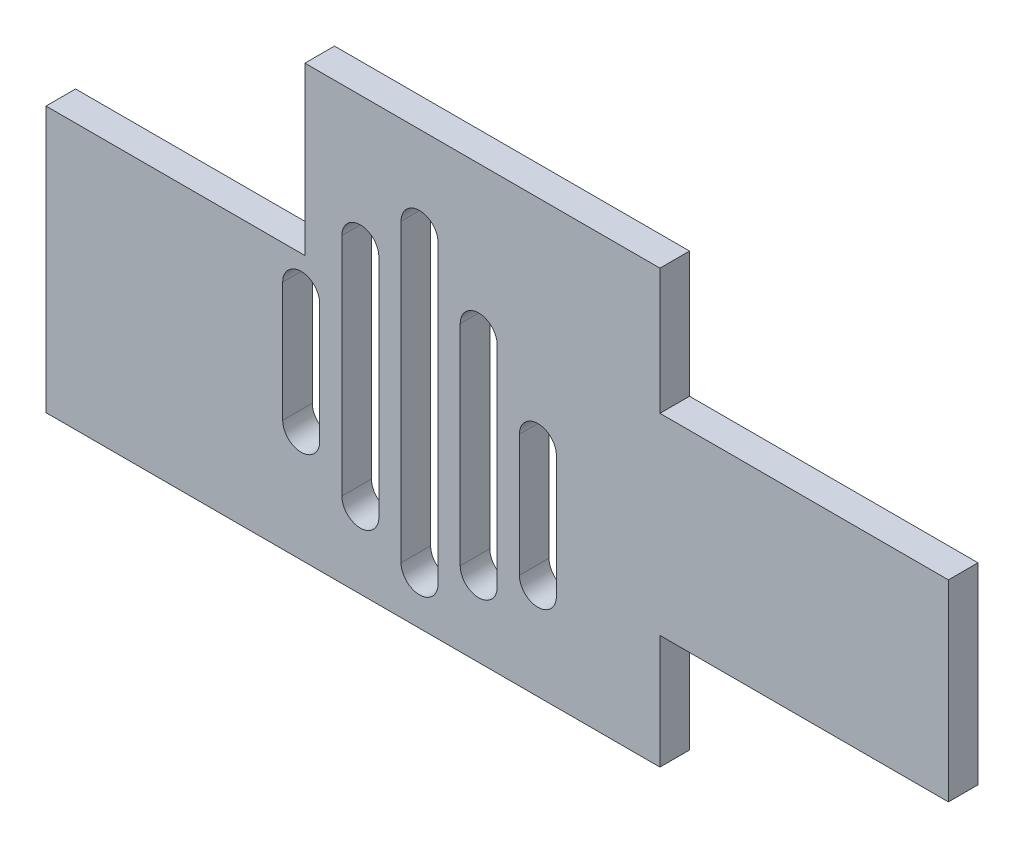
ISO-10303-21;
HEADER;
FILE_DESCRIPTION(('STEP AP214'),'2;1');
FILE_NAME('part.step','',(''),(''),'','','');
FILE_SCHEMA(('AUTOMOTIVE_DESIGN { 1 0 10303 214 1 1 1 1 }'));
ENDSEC;
DATA;
#1=APPLICATION_CONTEXT('core data for automotive mechanical design processes');
#2=APPLICATION_PROTOCOL_DEFINITION('international standard','automotive_design',2000,#1);
#3=PRODUCT_CONTEXT('',#1,'mechanical');
#4=PRODUCT('Part','Part','',(#3));
#5=PRODUCT_RELATED_PRODUCT_CATEGORY('part','',(#4));
#6=PRODUCT_DEFINITION_FORMATION('','',#4);
#7=PRODUCT_DEFINITION_CONTEXT('part definition',#1,'design');
#8=PRODUCT_DEFINITION('design','',#6,#7);
#9=PRODUCT_DEFINITION_SHAPE('','',#8);
#10=(LENGTH_UNIT() NAMED_UNIT(*) SI_UNIT(.MILLI.,.METRE.));
#11=(NAMED_UNIT(*) PLANE_ANGLE_UNIT() SI_UNIT($,.RADIAN.));
#12=(NAMED_UNIT(*) SI_UNIT($,.STERADIAN.) SOLID_ANGLE_UNIT());
#13=UNCERTAINTY_MEASURE_WITH_UNIT(LENGTH_MEASURE(1.E-05),#10,'distance_accuracy_value','');
#14=(GEOMETRIC_REPRESENTATION_CONTEXT(3) GLOBAL_UNCERTAINTY_ASSIGNED_CONTEXT((#13)) GLOBAL_UNIT_ASSIGNED_CONTEXT((#10,
#11,#12)) REPRESENTATION_CONTEXT('',''));
#15=CARTESIAN_POINT('',(0.,0.,0.));
#16=DIRECTION('',(0.,0.,1.));
#17=DIRECTION('',(1.,0.,0.));
#18=AXIS2_PLACEMENT_3D('',#15,#16,#17);
#19=CARTESIAN_POINT('',(0.,0.,4.));
#20=DIRECTION('',(0.,0.,1.));
#21=DIRECTION('',(1.,0.,0.));
#22=AXIS2_PLACEMENT_3D('',#19,#20,#21);
#23=PLANE('',#22);
#24=DIRECTION('',(1.,0.,0.));
#25=VECTOR('',#24,1.);
#26=CARTESIAN_POINT('',(30.8627181714712,-7.43085106382974,4.));
#27=LINE('',#26,#25);
#28=CARTESIAN_POINT('',(-52.1372818285288,-7.43085106382977,4.));
#29=VERTEX_POINT('',#28);
#30=CARTESIAN_POINT('',(30.8627181714712,-7.43085106382974,4.));
#31=VERTEX_POINT('',#30);
#32=EDGE_CURVE('E390',#29,#31,#27,.T.);
#33=ORIENTED_EDGE('',*,*,#32,.T.);
#34=DIRECTION('',(0.,1.,0.));
#35=VECTOR('',#34,1.);
#36=CARTESIAN_POINT('',(30.8627181714712,7.99405413062526,4.));
#37=LINE('',#36,#35);
#38=CARTESIAN_POINT('',(30.8627181714712,7.99405413062526,4.));
#39=VERTEX_POINT('',#38);
#40=EDGE_CURVE('E393',#31,#39,#37,.T.);
#41=ORIENTED_EDGE('',*,*,#40,.T.);
#42=DIRECTION('',(1.,0.,0.));
#43=VECTOR('',#42,1.);
#44=CARTESIAN_POINT('',(30.8627181714712,7.99405413062526,4.));
#45=LINE('',#44,#43);
#46=CARTESIAN_POINT('',(69.8627181714712,7.99405413062526,4.));
#47=VERTEX_POINT('',#46);
#48=EDGE_CURVE('E396',#39,#47,#45,.T.);
#49=ORIENTED_EDGE('',*,*,#48,.T.);
#50=DIRECTION('',(0.,1.,0.));
#51=VECTOR('',#50,1.);
#52=CARTESIAN_POINT('',(69.8627181714712,33.9940541306253,4.));
#53=LINE('',#52,#51);
#54=CARTESIAN_POINT('',(69.8627181714712,33.9940541306253,4.));
#55=VERTEX_POINT('',#54);
#56=EDGE_CURVE('E398',#47,#55,#53,.T.);
#57=ORIENTED_EDGE('',*,*,#56,.T.);
#58=DIRECTION('',(-1.,0.,0.));
#59=VECTOR('',#58,1.);
#60=CARTESIAN_POINT('',(30.8627181714712,33.9940541306253,4.));
#61=LINE('',#60,#59);
#62=CARTESIAN_POINT('',(30.8627181714712,33.9940541306253,4.));
#63=VERTEX_POINT('',#62);
#64=EDGE_CURVE('E400',#55,#63,#61,.T.);
#65=ORIENTED_EDGE('',*,*,#64,.T.);
#66=DIRECTION('',(0.,1.,0.));
#67=VECTOR('',#66,1.);
#68=CARTESIAN_POINT('',(30.8627181714712,50.9940541306253,4.));
#69=LINE('',#68,#67);
#70=CARTESIAN_POINT('',(30.8627181714712,50.9940541306253,4.));
#71=VERTEX_POINT('',#70);
#72=EDGE_CURVE('E402',#63,#71,#69,.T.);
#73=ORIENTED_EDGE('',*,*,#72,.T.);
#74=DIRECTION('',(-1.,0.,0.));
#75=VECTOR('',#74,1.);
#76=CARTESIAN_POINT('',(30.8627181714712,50.9940541306253,4.));
#77=LINE('',#76,#75);
#78=CARTESIAN_POINT('',(-17.1372818285288,50.9940541306253,4.));
#79=VERTEX_POINT('',#78);
#80=EDGE_CURVE('E404',#71,#79,#77,.T.);
#81=ORIENTED_EDGE('',*,*,#80,.T.);
#82=DIRECTION('',(0.,-1.,0.));
#83=VECTOR('',#82,1.);
#84=CARTESIAN_POINT('',(-17.1372818285288,50.9940541306253,4.));
#85=LINE('',#84,#83);
#86=CARTESIAN_POINT('',(-17.1372818285288,28.4723046370912,4.));
#87=VERTEX_POINT('',#86);
#88=EDGE_CURVE('E406',#79,#87,#85,.T.);
#89=ORIENTED_EDGE('',*,*,#88,.T.);
#90=DIRECTION('',(-1.,0.,0.));
#91=VECTOR('',#90,1.);
#92=CARTESIAN_POINT('',(-17.1372818285288,28.4723046370912,4.));
#93=LINE('',#92,#91);
#94=CARTESIAN_POINT('',(-52.1372818285288,28.4723046370912,4.));
#95=VERTEX_POINT('',#94);
#96=EDGE_CURVE('E408',#87,#95,#93,.T.);
#97=ORIENTED_EDGE('',*,*,#96,.T.);
#98=DIRECTION('',(0.,-1.,0.));
#99=VECTOR('',#98,1.);
#100=CARTESIAN_POINT('',(-52.1372818285288,28.4723046370912,4.));
#101=LINE('',#100,#99);
#102=EDGE_CURVE('E410',#95,#29,#101,.T.);
#103=ORIENTED_EDGE('',*,*,#102,.T.);
#104=EDGE_LOOP('',(#33,#41,#49,#57,#65,#73,#81,#89,#97,#103));
#105=FACE_BOUND('',#104,.T.);
#106=DIRECTION('',(0.,-1.,0.));
#107=VECTOR('',#106,1.);
#108=CARTESIAN_POINT('',(-4.13728182852882,38.9940541306252,4.));
#109=LINE('',#108,#107);
#110=CARTESIAN_POINT('',(-4.13728182852882,38.9940541306252,4.));
#111=VERTEX_POINT('',#110);
#112=CARTESIAN_POINT('',(-4.13728182852882,-1.00594586937475,4.));
#113=VERTEX_POINT('',#112);
#114=EDGE_CURVE('E361',#111,#113,#109,.T.);
#115=ORIENTED_EDGE('',*,*,#114,.F.);
#116=CARTESIAN_POINT('',(-1.63728182852882,38.9940541306252,4.));
#117=DIRECTION('',(0.,0.,1.));
#118=DIRECTION('',(-1.,0.,0.));
#119=AXIS2_PLACEMENT_3D('',#116,#117,#118);
#120=CIRCLE('',#119,2.5);
#121=CARTESIAN_POINT('',(0.862718171471179,38.9940541306252,4.));
#122=VERTEX_POINT('',#121);
#123=EDGE_CURVE('E359',#122,#111,#120,.T.);
#124=ORIENTED_EDGE('',*,*,#123,.F.);
#125=DIRECTION('',(0.,1.,0.));
#126=VECTOR('',#125,1.);
#127=CARTESIAN_POINT('',(0.862718171471179,38.9940541306252,4.));
#128=LINE('',#127,#126);
#129=CARTESIAN_POINT('',(0.862718171471179,-1.00594586937475,4.));
#130=VERTEX_POINT('',#129);
#131=EDGE_CURVE('E367',#130,#122,#128,.T.);
#132=ORIENTED_EDGE('',*,*,#131,.F.);
#133=CARTESIAN_POINT('',(-1.63728182852882,-1.00594586937475,4.));
#134=DIRECTION('',(0.,0.,1.));
#135=DIRECTION('',(-1.,0.,0.));
#136=AXIS2_PLACEMENT_3D('',#133,#134,#135);
#137=CIRCLE('',#136,2.5);
#138=EDGE_CURVE('E364',#113,#130,#137,.T.);
#139=ORIENTED_EDGE('',*,*,#138,.F.);
#140=EDGE_LOOP('',(#115,#124,#132,#139));
#141=FACE_BOUND('',#140,.T.);
#142=DIRECTION('',(0.,-1.,0.));
#143=VECTOR('',#142,1.);
#144=CARTESIAN_POINT('',(-12.1372818285288,33.3124319025332,4.));
#145=LINE('',#144,#143);
#146=CARTESIAN_POINT('',(-12.1372818285288,33.3124319025332,4.));
#147=VERTEX_POINT('',#146);
#148=CARTESIAN_POINT('',(-12.1372818285288,2.80982789630503,4.));
#149=VERTEX_POINT('',#148);
#150=EDGE_CURVE('E330',#147,#149,#145,.T.);
#151=ORIENTED_EDGE('',*,*,#150,.F.);
#152=CARTESIAN_POINT('',(-9.63728182852882,33.3124319025332,4.));
#153=DIRECTION('',(0.,0.,1.));
#154=DIRECTION('',(-1.,0.,0.));
#155=AXIS2_PLACEMENT_3D('',#152,#153,#154);
#156=CIRCLE('',#155,2.5);
#157=CARTESIAN_POINT('',(-7.13728182852882,33.3124319025332,4.));
#158=VERTEX_POINT('',#157);
#159=EDGE_CURVE('E328',#158,#147,#156,.T.);
#160=ORIENTED_EDGE('',*,*,#159,.F.);
#161=DIRECTION('',(0.,1.,0.));
#162=VECTOR('',#161,1.);
#163=CARTESIAN_POINT('',(-7.13728182852882,33.3124319025332,4.));
#164=LINE('',#163,#162);
#165=CARTESIAN_POINT('',(-7.13728182852882,2.80982789630503,4.));
#166=VERTEX_POINT('',#165);
#167=EDGE_CURVE('E336',#166,#158,#164,.T.);
#168=ORIENTED_EDGE('',*,*,#167,.F.);
#169=CARTESIAN_POINT('',(-9.63728182852882,2.80982789630503,4.));
#170=DIRECTION('',(0.,0.,1.));
#171=DIRECTION('',(1.,0.,0.));
#172=AXIS2_PLACEMENT_3D('',#169,#170,#171);
#173=CIRCLE('',#172,2.5);
#174=EDGE_CURVE('E333',#149,#166,#173,.T.);
#175=ORIENTED_EDGE('',*,*,#174,.F.);
#176=EDGE_LOOP('',(#151,#160,#168,#175));
#177=FACE_BOUND('',#176,.T.);
#178=DIRECTION('',(0.,-1.,0.));
#179=VECTOR('',#178,1.);
#180=CARTESIAN_POINT('',(-20.1372818285288,23.8612835886495,4.));
#181=LINE('',#180,#179);
#182=CARTESIAN_POINT('',(-20.1372818285288,23.8612835886495,4.));
#183=VERTEX_POINT('',#182);
#184=CARTESIAN_POINT('',(-20.1372818285288,7.68344946237683,4.));
#185=VERTEX_POINT('',#184);
#186=EDGE_CURVE('E299',#183,#185,#181,.T.);
#187=ORIENTED_EDGE('',*,*,#186,.F.);
#188=CARTESIAN_POINT('',(-17.6372818285288,23.8612835886495,4.));
#189=DIRECTION('',(0.,0.,1.));
#190=DIRECTION('',(1.,0.,0.));
#191=AXIS2_PLACEMENT_3D('',#188,#189,#190);
#192=CIRCLE('',#191,2.5);
#193=CARTESIAN_POINT('',(-15.1372818285288,23.8612835886495,4.));
#194=VERTEX_POINT('',#193);
#195=EDGE_CURVE('E297',#194,#183,#192,.T.);
#196=ORIENTED_EDGE('',*,*,#195,.F.);
#197=DIRECTION('',(0.,1.,0.));
#198=VECTOR('',#197,1.);
#199=CARTESIAN_POINT('',(-15.1372818285288,23.8612835886495,4.));
#200=LINE('',#199,#198);
#201=CARTESIAN_POINT('',(-15.1372818285288,7.68344946237683,4.));
#202=VERTEX_POINT('',#201);
#203=EDGE_CURVE('E305',#202,#194,#200,.T.);
#204=ORIENTED_EDGE('',*,*,#203,.F.);
#205=CARTESIAN_POINT('',(-17.6372818285288,7.68344946237683,4.));
#206=DIRECTION('',(0.,0.,1.));
#207=DIRECTION('',(1.,0.,0.));
#208=AXIS2_PLACEMENT_3D('',#205,#206,#207);
#209=CIRCLE('',#208,2.5);
#210=EDGE_CURVE('E302',#185,#202,#209,.T.);
#211=ORIENTED_EDGE('',*,*,#210,.F.);
#212=EDGE_LOOP('',(#187,#196,#204,#211));
#213=FACE_BOUND('',#212,.T.);
#214=DIRECTION('',(0.,-1.,0.));
#215=VECTOR('',#214,1.);
#216=CARTESIAN_POINT('',(3.86271817147118,30.9940541306252,4.));
#217=LINE('',#216,#215);
#218=CARTESIAN_POINT('',(3.86271817147118,30.9940541306252,4.));
#219=VERTEX_POINT('',#218);
#220=CARTESIAN_POINT('',(3.86271817147118,2.64743444309961,4.));
#221=VERTEX_POINT('',#220);
#222=EDGE_CURVE('E268',#219,#221,#217,.T.);
#223=ORIENTED_EDGE('',*,*,#222,.F.);
#224=CARTESIAN_POINT('',(6.36271817147118,30.9940541306252,4.));
#225=DIRECTION('',(0.,0.,1.));
#226=DIRECTION('',(1.,0.,0.));
#227=AXIS2_PLACEMENT_3D('',#224,#225,#226);
#228=CIRCLE('',#227,2.5);
#229=CARTESIAN_POINT('',(8.86271817147118,30.9940541306252,4.));
#230=VERTEX_POINT('',#229);
#231=EDGE_CURVE('E266',#230,#219,#228,.T.);
#232=ORIENTED_EDGE('',*,*,#231,.F.);
#233=DIRECTION('',(0.,1.,0.));
#234=VECTOR('',#233,1.);
#235=CARTESIAN_POINT('',(8.86271817147118,30.9940541306252,4.));
#236=LINE('',#235,#234);
#237=CARTESIAN_POINT('',(8.86271817147118,2.64743444309961,4.));
#238=VERTEX_POINT('',#237);
#239=EDGE_CURVE('E274',#238,#230,#236,.T.);
#240=ORIENTED_EDGE('',*,*,#239,.F.);
#241=CARTESIAN_POINT('',(6.36271817147118,2.64743444309961,4.));
#242=DIRECTION('',(0.,0.,1.));
#243=DIRECTION('',(1.,0.,0.));
#244=AXIS2_PLACEMENT_3D('',#241,#242,#243);
#245=CIRCLE('',#244,2.5);
#246=EDGE_CURVE('E271',#221,#238,#245,.T.);
#247=ORIENTED_EDGE('',*,*,#246,.F.);
#248=EDGE_LOOP('',(#223,#232,#240,#247));
#249=FACE_BOUND('',#248,.T.);
#250=DIRECTION('',(0.,-1.,0.));
#251=VECTOR('',#250,1.);
#252=CARTESIAN_POINT('',(11.8627181714712,22.0482710062122,4.));
#253=LINE('',#252,#251);
#254=CARTESIAN_POINT('',(11.8627181714712,22.0482710062122,4.));
#255=VERTEX_POINT('',#254);
#256=CARTESIAN_POINT('',(11.8627181714712,5.53847301170768,4.));
#257=VERTEX_POINT('',#256);
#258=EDGE_CURVE('E238',#255,#257,#253,.T.);
#259=ORIENTED_EDGE('',*,*,#258,.F.);
#260=CARTESIAN_POINT('',(14.3627181714712,22.0482710062122,4.));
#261=DIRECTION('',(0.,0.,1.));
#262=DIRECTION('',(1.,0.,0.));
#263=AXIS2_PLACEMENT_3D('',#260,#261,#262);
#264=CIRCLE('',#263,2.5);
#265=CARTESIAN_POINT('',(16.8627181714712,22.0482710062122,4.));
#266=VERTEX_POINT('',#265);
#267=EDGE_CURVE('E230',#266,#255,#264,.T.);
#268=ORIENTED_EDGE('',*,*,#267,.F.);
#269=DIRECTION('',(0.,1.,0.));
#270=VECTOR('',#269,1.);
#271=CARTESIAN_POINT('',(16.8627181714712,22.0482710062122,4.));
#272=LINE('',#271,#270);
#273=CARTESIAN_POINT('',(16.8627181714712,5.53847301170768,4.));
#274=VERTEX_POINT('',#273);
#275=EDGE_CURVE('E252',#274,#266,#272,.T.);
#276=ORIENTED_EDGE('',*,*,#275,.F.);
#277=CARTESIAN_POINT('',(14.3627181714712,5.53847301170768,4.));
#278=DIRECTION('',(0.,0.,1.));
#279=DIRECTION('',(1.,0.,0.));
#280=AXIS2_PLACEMENT_3D('',#277,#278,#279);
#281=CIRCLE('',#280,2.5);
#282=EDGE_CURVE('E250',#257,#274,#281,.T.);
#283=ORIENTED_EDGE('',*,*,#282,.F.);
#284=EDGE_LOOP('',(#259,#268,#276,#283));
#285=FACE_BOUND('',#284,.T.);
#286=ADVANCED_FACE('F33',(#105,#141,#177,#213,#249,#285),#23,.T.);
#287=CARTESIAN_POINT('',(0.,0.,0.));
#288=DIRECTION('',(0.,0.,1.));
#289=DIRECTION('',(1.,0.,0.));
#290=AXIS2_PLACEMENT_3D('',#287,#288,#289);
#291=PLANE('',#290);
#292=CARTESIAN_POINT('',(6.36271817147118,30.9940541306252,0.));
#293=DIRECTION('',(0.,0.,1.));
#294=DIRECTION('',(1.,0.,0.));
#295=AXIS2_PLACEMENT_3D('',#292,#293,#294);
#296=CIRCLE('',#295,2.5);
#297=CARTESIAN_POINT('',(8.86271817147118,30.9940541306252,0.));
#298=VERTEX_POINT('',#297);
#299=CARTESIAN_POINT('',(3.86271817147118,30.9940541306252,0.));
#300=VERTEX_POINT('',#299);
#301=EDGE_CURVE('E246',#298,#300,#296,.T.);
#302=ORIENTED_EDGE('',*,*,#301,.T.);
#303=DIRECTION('',(0.,-1.,0.));
#304=VECTOR('',#303,1.);
#305=CARTESIAN_POINT('',(3.86271817147118,30.9940541306252,0.));
#306=LINE('',#305,#304);
#307=CARTESIAN_POINT('',(3.86271817147118,2.64743444309961,0.));
#308=VERTEX_POINT('',#307);
#309=EDGE_CURVE('E279',#300,#308,#306,.T.);
#310=ORIENTED_EDGE('',*,*,#309,.T.);
#311=CARTESIAN_POINT('',(6.36271817147118,2.64743444309961,0.));
#312=DIRECTION('',(0.,0.,1.));
#313=DIRECTION('',(1.,0.,0.));
#314=AXIS2_PLACEMENT_3D('',#311,#312,#313);
#315=CIRCLE('',#314,2.5);
#316=CARTESIAN_POINT('',(8.86271817147118,2.64743444309961,0.));
#317=VERTEX_POINT('',#316);
#318=EDGE_CURVE('E282',#308,#317,#315,.T.);
#319=ORIENTED_EDGE('',*,*,#318,.T.);
#320=DIRECTION('',(0.,1.,0.));
#321=VECTOR('',#320,1.);
#322=CARTESIAN_POINT('',(8.86271817147118,30.9940541306252,0.));
#323=LINE('',#322,#321);
#324=EDGE_CURVE('E269',#317,#298,#323,.T.);
#325=ORIENTED_EDGE('',*,*,#324,.T.);
#326=EDGE_LOOP('',(#302,#310,#319,#325));
#327=FACE_BOUND('',#326,.T.);
#328=CARTESIAN_POINT('',(-9.63728182852882,33.3124319025332,0.));
#329=DIRECTION('',(0.,0.,1.));
#330=DIRECTION('',(-1.,0.,0.));
#331=AXIS2_PLACEMENT_3D('',#328,#329,#330);
#332=CIRCLE('',#331,2.5);
#333=CARTESIAN_POINT('',(-7.13728182852882,33.3124319025332,0.));
#334=VERTEX_POINT('',#333);
#335=CARTESIAN_POINT('',(-12.1372818285288,33.3124319025332,0.));
#336=VERTEX_POINT('',#335);
#337=EDGE_CURVE('E327',#334,#336,#332,.T.);
#338=ORIENTED_EDGE('',*,*,#337,.T.);
#339=DIRECTION('',(0.,-1.,0.));
#340=VECTOR('',#339,1.);
#341=CARTESIAN_POINT('',(-12.1372818285288,33.3124319025332,0.));
#342=LINE('',#341,#340);
#343=CARTESIAN_POINT('',(-12.1372818285288,2.80982789630503,0.));
#344=VERTEX_POINT('',#343);
#345=EDGE_CURVE('E341',#336,#344,#342,.T.);
#346=ORIENTED_EDGE('',*,*,#345,.T.);
#347=CARTESIAN_POINT('',(-9.63728182852882,2.80982789630503,0.));
#348=DIRECTION('',(0.,0.,1.));
#349=DIRECTION('',(1.,0.,0.));
#350=AXIS2_PLACEMENT_3D('',#347,#348,#349);
#351=CIRCLE('',#350,2.5);
#352=CARTESIAN_POINT('',(-7.13728182852882,2.80982789630503,0.));
#353=VERTEX_POINT('',#352);
#354=EDGE_CURVE('E344',#344,#353,#351,.T.);
#355=ORIENTED_EDGE('',*,*,#354,.T.);
#356=DIRECTION('',(0.,1.,0.));
#357=VECTOR('',#356,1.);
#358=CARTESIAN_POINT('',(-7.13728182852882,33.3124319025332,0.));
#359=LINE('',#358,#357);
#360=EDGE_CURVE('E331',#353,#334,#359,.T.);
#361=ORIENTED_EDGE('',*,*,#360,.T.);
#362=EDGE_LOOP('',(#338,#346,#355,#361));
#363=FACE_BOUND('',#362,.T.);
#364=DIRECTION('',(1.,0.,0.));
#365=VECTOR('',#364,1.);
#366=CARTESIAN_POINT('',(30.8627181714712,-7.43085106382974,0.));
#367=LINE('',#366,#365);
#368=CARTESIAN_POINT('',(-52.1372818285288,-7.43085106382977,0.));
#369=VERTEX_POINT('',#368);
#370=CARTESIAN_POINT('',(30.8627181714712,-7.43085106382974,0.));
#371=VERTEX_POINT('',#370);
#372=EDGE_CURVE('E389',#369,#371,#367,.T.);
#373=ORIENTED_EDGE('',*,*,#372,.F.);
#374=DIRECTION('',(0.,-1.,0.));
#375=VECTOR('',#374,1.);
#376=CARTESIAN_POINT('',(-52.1372818285288,28.4723046370912,0.));
#377=LINE('',#376,#375);
#378=CARTESIAN_POINT('',(-52.1372818285288,28.4723046370912,0.));
#379=VERTEX_POINT('',#378);
#380=EDGE_CURVE('E394',#379,#369,#377,.T.);
#381=ORIENTED_EDGE('',*,*,#380,.F.);
#382=DIRECTION('',(-1.,0.,0.));
#383=VECTOR('',#382,1.);
#384=CARTESIAN_POINT('',(-17.1372818285288,28.4723046370912,0.));
#385=LINE('',#384,#383);
#386=CARTESIAN_POINT('',(-17.1372818285288,28.4723046370912,0.));
#387=VERTEX_POINT('',#386);
#388=EDGE_CURVE('E429',#387,#379,#385,.T.);
#389=ORIENTED_EDGE('',*,*,#388,.F.);
#390=DIRECTION('',(0.,-1.,0.));
#391=VECTOR('',#390,1.);
#392=CARTESIAN_POINT('',(-17.1372818285288,50.9940541306253,0.));
#393=LINE('',#392,#391);
#394=CARTESIAN_POINT('',(-17.1372818285288,50.9940541306253,0.));
#395=VERTEX_POINT('',#394);
#396=EDGE_CURVE('E427',#395,#387,#393,.T.);
#397=ORIENTED_EDGE('',*,*,#396,.F.);
#398=DIRECTION('',(-1.,0.,0.));
#399=VECTOR('',#398,1.);
#400=CARTESIAN_POINT('',(30.8627181714712,50.9940541306253,0.));
#401=LINE('',#400,#399);
#402=CARTESIAN_POINT('',(30.8627181714712,50.9940541306253,0.));
#403=VERTEX_POINT('',#402);
#404=EDGE_CURVE('E425',#403,#395,#401,.T.);
#405=ORIENTED_EDGE('',*,*,#404,.F.);
#406=DIRECTION('',(0.,1.,0.));
#407=VECTOR('',#406,1.);
#408=CARTESIAN_POINT('',(30.8627181714712,50.9940541306253,0.));
#409=LINE('',#408,#407);
#410=CARTESIAN_POINT('',(30.8627181714712,33.9940541306253,0.));
#411=VERTEX_POINT('',#410);
#412=EDGE_CURVE('E423',#411,#403,#409,.T.);
#413=ORIENTED_EDGE('',*,*,#412,.F.);
#414=DIRECTION('',(-1.,0.,0.));
#415=VECTOR('',#414,1.);
#416=CARTESIAN_POINT('',(30.8627181714712,33.9940541306253,0.));
#417=LINE('',#416,#415);
#418=CARTESIAN_POINT('',(69.8627181714712,33.9940541306253,0.));
#419=VERTEX_POINT('',#418);
#420=EDGE_CURVE('E421',#419,#411,#417,.T.);
#421=ORIENTED_EDGE('',*,*,#420,.F.);
#422=DIRECTION('',(0.,1.,0.));
#423=VECTOR('',#422,1.);
#424=CARTESIAN_POINT('',(69.8627181714712,33.9940541306253,0.));
#425=LINE('',#424,#423);
#426=CARTESIAN_POINT('',(69.8627181714712,7.99405413062526,0.));
#427=VERTEX_POINT('',#426);
#428=EDGE_CURVE('E419',#427,#419,#425,.T.);
#429=ORIENTED_EDGE('',*,*,#428,.F.);
#430=DIRECTION('',(1.,0.,0.));
#431=VECTOR('',#430,1.);
#432=CARTESIAN_POINT('',(30.8627181714712,7.99405413062526,0.));
#433=LINE('',#432,#431);
#434=CARTESIAN_POINT('',(30.8627181714712,7.99405413062526,0.));
#435=VERTEX_POINT('',#434);
#436=EDGE_CURVE('E417',#435,#427,#433,.T.);
#437=ORIENTED_EDGE('',*,*,#436,.F.);
#438=DIRECTION('',(0.,1.,0.));
#439=VECTOR('',#438,1.);
#440=CARTESIAN_POINT('',(30.8627181714712,7.99405413062526,0.));
#441=LINE('',#440,#439);
#442=EDGE_CURVE('E415',#371,#435,#441,.T.);
#443=ORIENTED_EDGE('',*,*,#442,.F.);
#444=EDGE_LOOP('',(#373,#381,#389,#397,#405,#413,#421,#429,#437,#443));
#445=FACE_BOUND('',#444,.T.);
#446=CARTESIAN_POINT('',(-1.63728182852882,38.9940541306252,0.));
#447=DIRECTION('',(0.,0.,1.));
#448=DIRECTION('',(-1.,0.,0.));
#449=AXIS2_PLACEMENT_3D('',#446,#447,#448);
#450=CIRCLE('',#449,2.5);
#451=CARTESIAN_POINT('',(0.862718171471179,38.9940541306252,0.));
#452=VERTEX_POINT('',#451);
#453=CARTESIAN_POINT('',(-4.13728182852882,38.9940541306252,0.));
#454=VERTEX_POINT('',#453);
#455=EDGE_CURVE('E358',#452,#454,#450,.T.);
#456=ORIENTED_EDGE('',*,*,#455,.T.);
#457=DIRECTION('',(0.,-1.,0.));
#458=VECTOR('',#457,1.);
#459=CARTESIAN_POINT('',(-4.13728182852882,38.9940541306252,0.));
#460=LINE('',#459,#458);
#461=CARTESIAN_POINT('',(-4.13728182852882,-1.00594586937475,0.));
#462=VERTEX_POINT('',#461);
#463=EDGE_CURVE('E372',#454,#462,#460,.T.);
#464=ORIENTED_EDGE('',*,*,#463,.T.);
#465=CARTESIAN_POINT('',(-1.63728182852882,-1.00594586937475,0.));
#466=DIRECTION('',(0.,0.,1.));
#467=DIRECTION('',(-1.,0.,0.));
#468=AXIS2_PLACEMENT_3D('',#465,#466,#467);
#469=CIRCLE('',#468,2.5);
#470=CARTESIAN_POINT('',(0.862718171471174,-1.00594586937475,0.));
#471=VERTEX_POINT('',#470);
#472=EDGE_CURVE('E375',#462,#471,#469,.T.);
#473=ORIENTED_EDGE('',*,*,#472,.T.);
#474=DIRECTION('',(0.,1.,0.));
#475=VECTOR('',#474,1.);
#476=CARTESIAN_POINT('',(0.862718171471179,38.9940541306252,0.));
#477=LINE('',#476,#475);
#478=EDGE_CURVE('E362',#471,#452,#477,.T.);
#479=ORIENTED_EDGE('',*,*,#478,.T.);
#480=EDGE_LOOP('',(#456,#464,#473,#479));
#481=FACE_BOUND('',#480,.T.);
#482=CARTESIAN_POINT('',(-17.6372818285288,23.8612835886495,0.));
#483=DIRECTION('',(0.,0.,1.));
#484=DIRECTION('',(1.,0.,0.));
#485=AXIS2_PLACEMENT_3D('',#482,#483,#484);
#486=CIRCLE('',#485,2.5);
#487=CARTESIAN_POINT('',(-15.1372818285288,23.8612835886495,0.));
#488=VERTEX_POINT('',#487);
#489=CARTESIAN_POINT('',(-20.1372818285288,23.8612835886495,0.));
#490=VERTEX_POINT('',#489);
#491=EDGE_CURVE('E296',#488,#490,#486,.T.);
#492=ORIENTED_EDGE('',*,*,#491,.T.);
#493=DIRECTION('',(0.,-1.,0.));
#494=VECTOR('',#493,1.);
#495=CARTESIAN_POINT('',(-20.1372818285288,23.8612835886495,0.));
#496=LINE('',#495,#494);
#497=CARTESIAN_POINT('',(-20.1372818285288,7.68344946237683,0.));
#498=VERTEX_POINT('',#497);
#499=EDGE_CURVE('E310',#490,#498,#496,.T.);
#500=ORIENTED_EDGE('',*,*,#499,.T.);
#501=CARTESIAN_POINT('',(-17.6372818285288,7.68344946237683,0.));
#502=DIRECTION('',(0.,0.,1.));
#503=DIRECTION('',(1.,0.,0.));
#504=AXIS2_PLACEMENT_3D('',#501,#502,#503);
#505=CIRCLE('',#504,2.5);
#506=CARTESIAN_POINT('',(-15.1372818285288,7.68344946237683,0.));
#507=VERTEX_POINT('',#506);
#508=EDGE_CURVE('E313',#498,#507,#505,.T.);
#509=ORIENTED_EDGE('',*,*,#508,.T.);
#510=DIRECTION('',(0.,1.,0.));
#511=VECTOR('',#510,1.);
#512=CARTESIAN_POINT('',(-15.1372818285288,23.8612835886495,0.));
#513=LINE('',#512,#511);
#514=EDGE_CURVE('E300',#507,#488,#513,.T.);
#515=ORIENTED_EDGE('',*,*,#514,.T.);
#516=EDGE_LOOP('',(#492,#500,#509,#515));
#517=FACE_BOUND('',#516,.T.);
#518=CARTESIAN_POINT('',(14.3627181714712,22.0482710062122,0.));
#519=DIRECTION('',(0.,0.,1.));
#520=DIRECTION('',(1.,0.,0.));
#521=AXIS2_PLACEMENT_3D('',#518,#519,#520);
#522=CIRCLE('',#521,2.5);
#523=CARTESIAN_POINT('',(16.8627181714712,22.0482710062122,0.));
#524=VERTEX_POINT('',#523);
#525=CARTESIAN_POINT('',(11.8627181714712,22.0482710062122,0.));
#526=VERTEX_POINT('',#525);
#527=EDGE_CURVE('E56',#524,#526,#522,.T.);
#528=ORIENTED_EDGE('',*,*,#527,.T.);
#529=DIRECTION('',(0.,-1.,0.));
#530=VECTOR('',#529,1.);
#531=CARTESIAN_POINT('',(11.8627181714712,22.0482710062122,0.));
#532=LINE('',#531,#530);
#533=CARTESIAN_POINT('',(11.8627181714712,5.53847301170768,0.));
#534=VERTEX_POINT('',#533);
#535=EDGE_CURVE('E245',#526,#534,#532,.T.);
#536=ORIENTED_EDGE('',*,*,#535,.T.);
#537=CARTESIAN_POINT('',(14.3627181714712,5.53847301170768,0.));
#538=DIRECTION('',(0.,0.,1.));
#539=DIRECTION('',(1.,0.,0.));
#540=AXIS2_PLACEMENT_3D('',#537,#538,#539);
#541=CIRCLE('',#540,2.5);
#542=CARTESIAN_POINT('',(16.8627181714712,5.53847301170768,0.));
#543=VERTEX_POINT('',#542);
#544=EDGE_CURVE('E258',#534,#543,#541,.T.);
#545=ORIENTED_EDGE('',*,*,#544,.T.);
#546=DIRECTION('',(0.,1.,0.));
#547=VECTOR('',#546,1.);
#548=CARTESIAN_POINT('',(16.8627181714712,22.0482710062122,0.));
#549=LINE('',#548,#547);
#550=EDGE_CURVE('E239',#543,#524,#549,.T.);
#551=ORIENTED_EDGE('',*,*,#550,.T.);
#552=EDGE_LOOP('',(#528,#536,#545,#551));
#553=FACE_BOUND('',#552,.T.);
#554=ADVANCED_FACE('F465',(#327,#363,#445,#481,#517,#553),#291,.F.);
#555=CARTESIAN_POINT('',(30.8627181714712,-7.43085106382974,4.));
#556=DIRECTION('',(0.,1.,0.));
#557=DIRECTION('',(-1.,0.,0.));
#558=AXIS2_PLACEMENT_3D('',#555,#556,#557);
#559=PLANE('',#558);
#560=ORIENTED_EDGE('',*,*,#372,.T.);
#561=DIRECTION('',(0.,0.,-1.));
#562=VECTOR('',#561,1.);
#563=CARTESIAN_POINT('',(30.8627181714712,-7.43085106382974,4.));
#564=LINE('',#563,#562);
#565=EDGE_CURVE('E11',#31,#371,#564,.T.);
#566=ORIENTED_EDGE('',*,*,#565,.F.);
#567=ORIENTED_EDGE('',*,*,#32,.F.);
#568=DIRECTION('',(0.,0.,-1.));
#569=VECTOR('',#568,1.);
#570=CARTESIAN_POINT('',(-52.1372818285288,-7.43085106382977,4.));
#571=LINE('',#570,#569);
#572=EDGE_CURVE('E412',#29,#369,#571,.T.);
#573=ORIENTED_EDGE('',*,*,#572,.T.);
#574=EDGE_LOOP('',(#560,#566,#567,#573));
#575=FACE_BOUND('',#574,.T.);
#576=ADVANCED_FACE('F35',(#575),#559,.F.);
#577=CARTESIAN_POINT('',(30.8627181714712,7.99405413062526,4.));
#578=DIRECTION('',(-1.,0.,0.));
#579=DIRECTION('',(0.,-1.,0.));
#580=AXIS2_PLACEMENT_3D('',#577,#578,#579);
#581=PLANE('',#580);
#582=ORIENTED_EDGE('',*,*,#442,.T.);
#583=DIRECTION('',(0.,0.,-1.));
#584=VECTOR('',#583,1.);
#585=CARTESIAN_POINT('',(30.8627181714712,7.99405413062526,4.));
#586=LINE('',#585,#584);
#587=EDGE_CURVE('E41',#39,#435,#586,.T.);
#588=ORIENTED_EDGE('',*,*,#587,.F.);
#589=ORIENTED_EDGE('',*,*,#40,.F.);
#590=ORIENTED_EDGE('',*,*,#565,.T.);
#591=EDGE_LOOP('',(#582,#588,#589,#590));
#592=FACE_BOUND('',#591,.T.);
#593=ADVANCED_FACE('F483',(#592),#581,.F.);
#594=CARTESIAN_POINT('',(30.8627181714712,7.99405413062526,4.));
#595=DIRECTION('',(0.,1.,0.));
#596=DIRECTION('',(0.,0.,1.));
#597=AXIS2_PLACEMENT_3D('',#594,#595,#596);
#598=PLANE('',#597);
#599=ORIENTED_EDGE('',*,*,#436,.T.);
#600=DIRECTION('',(0.,0.,-1.));
#601=VECTOR('',#600,1.);
#602=CARTESIAN_POINT('',(69.8627181714712,7.99405413062526,4.));
#603=LINE('',#602,#601);
#604=EDGE_CURVE('E452',#47,#427,#603,.T.);
#605=ORIENTED_EDGE('',*,*,#604,.F.);
#606=ORIENTED_EDGE('',*,*,#48,.F.);
#607=ORIENTED_EDGE('',*,*,#587,.T.);
#608=EDGE_LOOP('',(#599,#605,#606,#607));
#609=FACE_BOUND('',#608,.T.);
#610=ADVANCED_FACE('F459',(#609),#598,.F.);
#611=CARTESIAN_POINT('',(69.8627181714712,33.9940541306253,4.));
#612=DIRECTION('',(-1.,0.,0.));
#613=DIRECTION('',(0.,0.,1.));
#614=AXIS2_PLACEMENT_3D('',#611,#612,#613);
#615=PLANE('',#614);
#616=ORIENTED_EDGE('',*,*,#428,.T.);
#617=DIRECTION('',(0.,0.,-1.));
#618=VECTOR('',#617,1.);
#619=CARTESIAN_POINT('',(69.8627181714712,33.9940541306253,4.));
#620=LINE('',#619,#618);
#621=EDGE_CURVE('E449',#55,#419,#620,.T.);
#622=ORIENTED_EDGE('',*,*,#621,.F.);
#623=ORIENTED_EDGE('',*,*,#56,.F.);
#624=ORIENTED_EDGE('',*,*,#604,.T.);
#625=EDGE_LOOP('',(#616,#622,#623,#624));
#626=FACE_BOUND('',#625,.T.);
#627=ADVANCED_FACE('F471',(#626),#615,.F.);
#628=CARTESIAN_POINT('',(30.8627181714712,33.9940541306253,4.));
#629=DIRECTION('',(0.,-1.,0.));
#630=DIRECTION('',(0.,0.,-1.));
#631=AXIS2_PLACEMENT_3D('',#628,#629,#630);
#632=PLANE('',#631);
#633=ORIENTED_EDGE('',*,*,#420,.T.);
#634=DIRECTION('',(0.,0.,-1.));
#635=VECTOR('',#634,1.);
#636=CARTESIAN_POINT('',(30.8627181714712,33.9940541306253,4.));
#637=LINE('',#636,#635);
#638=EDGE_CURVE('E446',#63,#411,#637,.T.);
#639=ORIENTED_EDGE('',*,*,#638,.F.);
#640=ORIENTED_EDGE('',*,*,#64,.F.);
#641=ORIENTED_EDGE('',*,*,#621,.T.);
#642=EDGE_LOOP('',(#633,#639,#640,#641));
#643=FACE_BOUND('',#642,.T.);
#644=ADVANCED_FACE('F475',(#643),#632,.F.);
#645=CARTESIAN_POINT('',(30.8627181714712,50.9940541306253,4.));
#646=DIRECTION('',(-1.,0.,0.));
#647=DIRECTION('',(0.,-1.,0.));
#648=AXIS2_PLACEMENT_3D('',#645,#646,#647);
#649=PLANE('',#648);
#650=ORIENTED_EDGE('',*,*,#412,.T.);
#651=DIRECTION('',(0.,0.,-1.));
#652=VECTOR('',#651,1.);
#653=CARTESIAN_POINT('',(30.8627181714712,50.9940541306253,4.));
#654=LINE('',#653,#652);
#655=EDGE_CURVE('E443',#71,#403,#654,.T.);
#656=ORIENTED_EDGE('',*,*,#655,.F.);
#657=ORIENTED_EDGE('',*,*,#72,.F.);
#658=ORIENTED_EDGE('',*,*,#638,.T.);
#659=EDGE_LOOP('',(#650,#656,#657,#658));
#660=FACE_BOUND('',#659,.T.);
#661=ADVANCED_FACE('F506',(#660),#649,.F.);
#662=CARTESIAN_POINT('',(30.8627181714712,50.9940541306253,4.));
#663=DIRECTION('',(0.,-1.,0.));
#664=DIRECTION('',(1.,0.,0.));
#665=AXIS2_PLACEMENT_3D('',#662,#663,#664);
#666=PLANE('',#665);
#667=ORIENTED_EDGE('',*,*,#404,.T.);
#668=DIRECTION('',(0.,0.,-1.));
#669=VECTOR('',#668,1.);
#670=CARTESIAN_POINT('',(-17.1372818285288,50.9940541306253,4.));
#671=LINE('',#670,#669);
#672=EDGE_CURVE('E440',#79,#395,#671,.T.);
#673=ORIENTED_EDGE('',*,*,#672,.F.);
#674=ORIENTED_EDGE('',*,*,#80,.F.);
#675=ORIENTED_EDGE('',*,*,#655,.T.);
#676=EDGE_LOOP('',(#667,#673,#674,#675));
#677=FACE_BOUND('',#676,.T.);
#678=ADVANCED_FACE('F503',(#677),#666,.F.);
#679=CARTESIAN_POINT('',(-17.1372818285288,50.9940541306253,4.));
#680=DIRECTION('',(1.,0.,0.));
#681=DIRECTION('',(0.,1.,0.));
#682=AXIS2_PLACEMENT_3D('',#679,#680,#681);
#683=PLANE('',#682);
#684=ORIENTED_EDGE('',*,*,#396,.T.);
#685=DIRECTION('',(0.,0.,-1.));
#686=VECTOR('',#685,1.);
#687=CARTESIAN_POINT('',(-17.1372818285288,28.4723046370912,4.));
#688=LINE('',#687,#686);
#689=EDGE_CURVE('E437',#87,#387,#688,.T.);
#690=ORIENTED_EDGE('',*,*,#689,.F.);
#691=ORIENTED_EDGE('',*,*,#88,.F.);
#692=ORIENTED_EDGE('',*,*,#672,.T.);
#693=EDGE_LOOP('',(#684,#690,#691,#692));
#694=FACE_BOUND('',#693,.T.);
#695=ADVANCED_FACE('F499',(#694),#683,.F.);
#696=CARTESIAN_POINT('',(-17.1372818285288,28.4723046370912,4.));
#697=DIRECTION('',(0.,-1.,0.));
#698=DIRECTION('',(1.,0.,0.));
#699=AXIS2_PLACEMENT_3D('',#696,#697,#698);
#700=PLANE('',#699);
#701=ORIENTED_EDGE('',*,*,#388,.T.);
#702=DIRECTION('',(0.,0.,-1.));
#703=VECTOR('',#702,1.);
#704=CARTESIAN_POINT('',(-52.1372818285288,28.4723046370912,4.));
#705=LINE('',#704,#703);
#706=EDGE_CURVE('E434',#95,#379,#705,.T.);
#707=ORIENTED_EDGE('',*,*,#706,.F.);
#708=ORIENTED_EDGE('',*,*,#96,.F.);
#709=ORIENTED_EDGE('',*,*,#689,.T.);
#710=EDGE_LOOP('',(#701,#707,#708,#709));
#711=FACE_BOUND('',#710,.T.);
#712=ADVANCED_FACE('F495',(#711),#700,.F.);
#713=CARTESIAN_POINT('',(-52.1372818285288,28.4723046370912,4.));
#714=DIRECTION('',(1.,0.,0.));
#715=DIRECTION('',(0.,1.,0.));
#716=AXIS2_PLACEMENT_3D('',#713,#714,#715);
#717=PLANE('',#716);
#718=ORIENTED_EDGE('',*,*,#380,.T.);
#719=ORIENTED_EDGE('',*,*,#572,.F.);
#720=ORIENTED_EDGE('',*,*,#102,.F.);
#721=ORIENTED_EDGE('',*,*,#706,.T.);
#722=EDGE_LOOP('',(#718,#719,#720,#721));
#723=FACE_BOUND('',#722,.T.);
#724=ADVANCED_FACE('F490',(#723),#717,.F.);
#725=CARTESIAN_POINT('',(-1.63728182852882,38.9940541306252,4.));
#726=DIRECTION('',(0.,0.,-1.));
#727=DIRECTION('',(-1.,0.,0.));
#728=AXIS2_PLACEMENT_3D('',#725,#726,#727);
#729=CYLINDRICAL_SURFACE('',#728,2.5);
#730=ORIENTED_EDGE('',*,*,#455,.F.);
#731=DIRECTION('',(0.,0.,-1.));
#732=VECTOR('',#731,1.);
#733=CARTESIAN_POINT('',(0.862718171471179,38.9940541306252,4.));
#734=LINE('',#733,#732);
#735=EDGE_CURVE('E369',#122,#452,#734,.T.);
#736=ORIENTED_EDGE('',*,*,#735,.F.);
#737=ORIENTED_EDGE('',*,*,#123,.T.);
#738=DIRECTION('',(0.,0.,-1.));
#739=VECTOR('',#738,1.);
#740=CARTESIAN_POINT('',(-4.13728182852882,38.9940541306252,4.));
#741=LINE('',#740,#739);
#742=EDGE_CURVE('E386',#111,#454,#741,.T.);
#743=ORIENTED_EDGE('',*,*,#742,.T.);
#744=EDGE_LOOP('',(#730,#736,#737,#743));
#745=FACE_BOUND('',#744,.T.);
#746=ADVANCED_FACE('F523',(#745),#729,.F.);
#747=CARTESIAN_POINT('',(-4.13728182852882,38.9940541306252,4.));
#748=DIRECTION('',(1.,0.,0.));
#749=DIRECTION('',(0.,1.,0.));
#750=AXIS2_PLACEMENT_3D('',#747,#748,#749);
#751=PLANE('',#750);
#752=ORIENTED_EDGE('',*,*,#463,.F.);
#753=ORIENTED_EDGE('',*,*,#742,.F.);
#754=ORIENTED_EDGE('',*,*,#114,.T.);
#755=DIRECTION('',(0.,0.,-1.));
#756=VECTOR('',#755,1.);
#757=CARTESIAN_POINT('',(-4.13728182852882,-1.00594586937475,4.));
#758=LINE('',#757,#756);
#759=EDGE_CURVE('E384',#113,#462,#758,.T.);
#760=ORIENTED_EDGE('',*,*,#759,.T.);
#761=EDGE_LOOP('',(#752,#753,#754,#760));
#762=FACE_BOUND('',#761,.T.);
#763=ADVANCED_FACE('F549',(#762),#751,.T.);
#764=CARTESIAN_POINT('',(-1.63728182852882,-1.00594586937475,4.));
#765=DIRECTION('',(0.,0.,-1.));
#766=DIRECTION('',(-1.,0.,0.));
#767=AXIS2_PLACEMENT_3D('',#764,#765,#766);
#768=CYLINDRICAL_SURFACE('',#767,2.5);
#769=ORIENTED_EDGE('',*,*,#472,.F.);
#770=ORIENTED_EDGE('',*,*,#759,.F.);
#771=ORIENTED_EDGE('',*,*,#138,.T.);
#772=DIRECTION('',(0.,0.,-1.));
#773=VECTOR('',#772,1.);
#774=CARTESIAN_POINT('',(0.862718171471174,-1.00594586937475,4.));
#775=LINE('',#774,#773);
#776=EDGE_CURVE('E382',#130,#471,#775,.T.);
#777=ORIENTED_EDGE('',*,*,#776,.T.);
#778=EDGE_LOOP('',(#769,#770,#771,#777));
#779=FACE_BOUND('',#778,.T.);
#780=ADVANCED_FACE('F556',(#779),#768,.F.);
#781=CARTESIAN_POINT('',(0.862718171471179,38.9940541306252,4.));
#782=DIRECTION('',(-1.,0.,0.));
#783=DIRECTION('',(0.,0.,1.));
#784=AXIS2_PLACEMENT_3D('',#781,#782,#783);
#785=PLANE('',#784);
#786=ORIENTED_EDGE('',*,*,#478,.F.);
#787=ORIENTED_EDGE('',*,*,#776,.F.);
#788=ORIENTED_EDGE('',*,*,#131,.T.);
#789=ORIENTED_EDGE('',*,*,#735,.T.);
#790=EDGE_LOOP('',(#786,#787,#788,#789));
#791=FACE_BOUND('',#790,.T.);
#792=ADVANCED_FACE('F563',(#791),#785,.T.);
#793=CARTESIAN_POINT('',(-9.63728182852882,33.3124319025332,4.));
#794=DIRECTION('',(0.,0.,-1.));
#795=DIRECTION('',(-1.,0.,0.));
#796=AXIS2_PLACEMENT_3D('',#793,#794,#795);
#797=CYLINDRICAL_SURFACE('',#796,2.5);
#798=ORIENTED_EDGE('',*,*,#337,.F.);
#799=DIRECTION('',(0.,0.,-1.));
#800=VECTOR('',#799,1.);
#801=CARTESIAN_POINT('',(-7.13728182852882,33.3124319025332,4.));
#802=LINE('',#801,#800);
#803=EDGE_CURVE('E338',#158,#334,#802,.T.);
#804=ORIENTED_EDGE('',*,*,#803,.F.);
#805=ORIENTED_EDGE('',*,*,#159,.T.);
#806=DIRECTION('',(0.,0.,-1.));
#807=VECTOR('',#806,1.);
#808=CARTESIAN_POINT('',(-12.1372818285288,33.3124319025332,4.));
#809=LINE('',#808,#807);
#810=EDGE_CURVE('E355',#147,#336,#809,.T.);
#811=ORIENTED_EDGE('',*,*,#810,.T.);
#812=EDGE_LOOP('',(#798,#804,#805,#811));
#813=FACE_BOUND('',#812,.T.);
#814=ADVANCED_FACE('F571',(#813),#797,.F.);
#815=CARTESIAN_POINT('',(-12.1372818285288,33.3124319025332,4.));
#816=DIRECTION('',(1.,0.,0.));
#817=DIRECTION('',(0.,1.,0.));
#818=AXIS2_PLACEMENT_3D('',#815,#816,#817);
#819=PLANE('',#818);
#820=ORIENTED_EDGE('',*,*,#345,.F.);
#821=ORIENTED_EDGE('',*,*,#810,.F.);
#822=ORIENTED_EDGE('',*,*,#150,.T.);
#823=DIRECTION('',(0.,0.,-1.));
#824=VECTOR('',#823,1.);
#825=CARTESIAN_POINT('',(-12.1372818285288,2.80982789630503,4.));
#826=LINE('',#825,#824);
#827=EDGE_CURVE('E353',#149,#344,#826,.T.);
#828=ORIENTED_EDGE('',*,*,#827,.T.);
#829=EDGE_LOOP('',(#820,#821,#822,#828));
#830=FACE_BOUND('',#829,.T.);
#831=ADVANCED_FACE('F579',(#830),#819,.T.);
#832=CARTESIAN_POINT('',(-9.63728182852882,2.80982789630503,4.));
#833=DIRECTION('',(0.,0.,-1.));
#834=DIRECTION('',(-1.,0.,0.));
#835=AXIS2_PLACEMENT_3D('',#832,#833,#834);
#836=CYLINDRICAL_SURFACE('',#835,2.5);
#837=ORIENTED_EDGE('',*,*,#354,.F.);
#838=ORIENTED_EDGE('',*,*,#827,.F.);
#839=ORIENTED_EDGE('',*,*,#174,.T.);
#840=DIRECTION('',(0.,0.,-1.));
#841=VECTOR('',#840,1.);
#842=CARTESIAN_POINT('',(-7.13728182852882,2.80982789630503,4.));
#843=LINE('',#842,#841);
#844=EDGE_CURVE('E351',#166,#353,#843,.T.);
#845=ORIENTED_EDGE('',*,*,#844,.T.);
#846=EDGE_LOOP('',(#837,#838,#839,#845));
#847=FACE_BOUND('',#846,.T.);
#848=ADVANCED_FACE('F587',(#847),#836,.F.);
#849=CARTESIAN_POINT('',(-7.13728182852882,33.3124319025332,4.));
#850=DIRECTION('',(-1.,0.,0.));
#851=DIRECTION('',(0.,-1.,0.));
#852=AXIS2_PLACEMENT_3D('',#849,#850,#851);
#853=PLANE('',#852);
#854=ORIENTED_EDGE('',*,*,#360,.F.);
#855=ORIENTED_EDGE('',*,*,#844,.F.);
#856=ORIENTED_EDGE('',*,*,#167,.T.);
#857=ORIENTED_EDGE('',*,*,#803,.T.);
#858=EDGE_LOOP('',(#854,#855,#856,#857));
#859=FACE_BOUND('',#858,.T.);
#860=ADVANCED_FACE('F595',(#859),#853,.T.);
#861=CARTESIAN_POINT('',(-17.6372818285288,23.8612835886495,4.));
#862=DIRECTION('',(0.,0.,-1.));
#863=DIRECTION('',(-1.,0.,0.));
#864=AXIS2_PLACEMENT_3D('',#861,#862,#863);
#865=CYLINDRICAL_SURFACE('',#864,2.5);
#866=ORIENTED_EDGE('',*,*,#491,.F.);
#867=DIRECTION('',(0.,0.,-1.));
#868=VECTOR('',#867,1.);
#869=CARTESIAN_POINT('',(-15.1372818285288,23.8612835886495,4.));
#870=LINE('',#869,#868);
#871=EDGE_CURVE('E307',#194,#488,#870,.T.);
#872=ORIENTED_EDGE('',*,*,#871,.F.);
#873=ORIENTED_EDGE('',*,*,#195,.T.);
#874=DIRECTION('',(0.,0.,-1.));
#875=VECTOR('',#874,1.);
#876=CARTESIAN_POINT('',(-20.1372818285288,23.8612835886495,4.));
#877=LINE('',#876,#875);
#878=EDGE_CURVE('E324',#183,#490,#877,.T.);
#879=ORIENTED_EDGE('',*,*,#878,.T.);
#880=EDGE_LOOP('',(#866,#872,#873,#879));
#881=FACE_BOUND('',#880,.T.);
#882=ADVANCED_FACE('F603',(#881),#865,.F.);
#883=CARTESIAN_POINT('',(-20.1372818285288,23.8612835886495,4.));
#884=DIRECTION('',(1.,0.,0.));
#885=DIRECTION('',(0.,0.,-1.));
#886=AXIS2_PLACEMENT_3D('',#883,#884,#885);
#887=PLANE('',#886);
#888=ORIENTED_EDGE('',*,*,#499,.F.);
#889=ORIENTED_EDGE('',*,*,#878,.F.);
#890=ORIENTED_EDGE('',*,*,#186,.T.);
#891=DIRECTION('',(0.,0.,-1.));
#892=VECTOR('',#891,1.);
#893=CARTESIAN_POINT('',(-20.1372818285288,7.68344946237683,4.));
#894=LINE('',#893,#892);
#895=EDGE_CURVE('E322',#185,#498,#894,.T.);
#896=ORIENTED_EDGE('',*,*,#895,.T.);
#897=EDGE_LOOP('',(#888,#889,#890,#896));
#898=FACE_BOUND('',#897,.T.);
#899=ADVANCED_FACE('F611',(#898),#887,.T.);
#900=CARTESIAN_POINT('',(-17.6372818285288,7.68344946237683,4.));
#901=DIRECTION('',(0.,0.,-1.));
#902=DIRECTION('',(-1.,0.,0.));
#903=AXIS2_PLACEMENT_3D('',#900,#901,#902);
#904=CYLINDRICAL_SURFACE('',#903,2.5);
#905=ORIENTED_EDGE('',*,*,#508,.F.);
#906=ORIENTED_EDGE('',*,*,#895,.F.);
#907=ORIENTED_EDGE('',*,*,#210,.T.);
#908=DIRECTION('',(0.,0.,-1.));
#909=VECTOR('',#908,1.);
#910=CARTESIAN_POINT('',(-15.1372818285288,7.68344946237683,4.));
#911=LINE('',#910,#909);
#912=EDGE_CURVE('E320',#202,#507,#911,.T.);
#913=ORIENTED_EDGE('',*,*,#912,.T.);
#914=EDGE_LOOP('',(#905,#906,#907,#913));
#915=FACE_BOUND('',#914,.T.);
#916=ADVANCED_FACE('F619',(#915),#904,.F.);
#917=CARTESIAN_POINT('',(-15.1372818285288,23.8612835886495,4.));
#918=DIRECTION('',(-1.,0.,0.));
#919=DIRECTION('',(0.,-1.,0.));
#920=AXIS2_PLACEMENT_3D('',#917,#918,#919);
#921=PLANE('',#920);
#922=ORIENTED_EDGE('',*,*,#514,.F.);
#923=ORIENTED_EDGE('',*,*,#912,.F.);
#924=ORIENTED_EDGE('',*,*,#203,.T.);
#925=ORIENTED_EDGE('',*,*,#871,.T.);
#926=EDGE_LOOP('',(#922,#923,#924,#925));
#927=FACE_BOUND('',#926,.T.);
#928=ADVANCED_FACE('F627',(#927),#921,.T.);
#929=CARTESIAN_POINT('',(6.36271817147118,30.9940541306252,4.));
#930=DIRECTION('',(0.,0.,-1.));
#931=DIRECTION('',(-1.,0.,0.));
#932=AXIS2_PLACEMENT_3D('',#929,#930,#931);
#933=CYLINDRICAL_SURFACE('',#932,2.5);
#934=ORIENTED_EDGE('',*,*,#301,.F.);
#935=DIRECTION('',(0.,0.,-1.));
#936=VECTOR('',#935,1.);
#937=CARTESIAN_POINT('',(8.86271817147118,30.9940541306252,4.));
#938=LINE('',#937,#936);
#939=EDGE_CURVE('E276',#230,#298,#938,.T.);
#940=ORIENTED_EDGE('',*,*,#939,.F.);
#941=ORIENTED_EDGE('',*,*,#231,.T.);
#942=DIRECTION('',(0.,0.,-1.));
#943=VECTOR('',#942,1.);
#944=CARTESIAN_POINT('',(3.86271817147118,30.9940541306252,4.));
#945=LINE('',#944,#943);
#946=EDGE_CURVE('E293',#219,#300,#945,.T.);
#947=ORIENTED_EDGE('',*,*,#946,.T.);
#948=EDGE_LOOP('',(#934,#940,#941,#947));
#949=FACE_BOUND('',#948,.T.);
#950=ADVANCED_FACE('F635',(#949),#933,.F.);
#951=CARTESIAN_POINT('',(3.86271817147118,30.9940541306252,4.));
#952=DIRECTION('',(1.,0.,0.));
#953=DIRECTION('',(0.,0.,-1.));
#954=AXIS2_PLACEMENT_3D('',#951,#952,#953);
#955=PLANE('',#954);
#956=ORIENTED_EDGE('',*,*,#309,.F.);
#957=ORIENTED_EDGE('',*,*,#946,.F.);
#958=ORIENTED_EDGE('',*,*,#222,.T.);
#959=DIRECTION('',(0.,0.,-1.));
#960=VECTOR('',#959,1.);
#961=CARTESIAN_POINT('',(3.86271817147118,2.64743444309961,4.));
#962=LINE('',#961,#960);
#963=EDGE_CURVE('E291',#221,#308,#962,.T.);
#964=ORIENTED_EDGE('',*,*,#963,.T.);
#965=EDGE_LOOP('',(#956,#957,#958,#964));
#966=FACE_BOUND('',#965,.T.);
#967=ADVANCED_FACE('F643',(#966),#955,.T.);
#968=CARTESIAN_POINT('',(6.36271817147118,2.64743444309961,4.));
#969=DIRECTION('',(0.,0.,-1.));
#970=DIRECTION('',(-1.,0.,0.));
#971=AXIS2_PLACEMENT_3D('',#968,#969,#970);
#972=CYLINDRICAL_SURFACE('',#971,2.5);
#973=ORIENTED_EDGE('',*,*,#318,.F.);
#974=ORIENTED_EDGE('',*,*,#963,.F.);
#975=ORIENTED_EDGE('',*,*,#246,.T.);
#976=DIRECTION('',(0.,0.,-1.));
#977=VECTOR('',#976,1.);
#978=CARTESIAN_POINT('',(8.86271817147118,2.64743444309961,4.));
#979=LINE('',#978,#977);
#980=EDGE_CURVE('E289',#238,#317,#979,.T.);
#981=ORIENTED_EDGE('',*,*,#980,.T.);
#982=EDGE_LOOP('',(#973,#974,#975,#981));
#983=FACE_BOUND('',#982,.T.);
#984=ADVANCED_FACE('F651',(#983),#972,.F.);
#985=CARTESIAN_POINT('',(8.86271817147118,30.9940541306252,4.));
#986=DIRECTION('',(-1.,0.,0.));
#987=DIRECTION('',(0.,0.,1.));
#988=AXIS2_PLACEMENT_3D('',#985,#986,#987);
#989=PLANE('',#988);
#990=ORIENTED_EDGE('',*,*,#324,.F.);
#991=ORIENTED_EDGE('',*,*,#980,.F.);
#992=ORIENTED_EDGE('',*,*,#239,.T.);
#993=ORIENTED_EDGE('',*,*,#939,.T.);
#994=EDGE_LOOP('',(#990,#991,#992,#993));
#995=FACE_BOUND('',#994,.T.);
#996=ADVANCED_FACE('F659',(#995),#989,.T.);
#997=CARTESIAN_POINT('',(14.3627181714712,22.0482710062122,4.));
#998=DIRECTION('',(0.,0.,-1.));
#999=DIRECTION('',(-1.,0.,0.));
#1000=AXIS2_PLACEMENT_3D('',#997,#998,#999);
#1001=CYLINDRICAL_SURFACE('',#1000,2.5);
#1002=ORIENTED_EDGE('',*,*,#527,.F.);
#1003=DIRECTION('',(0.,0.,-1.));
#1004=VECTOR('',#1003,1.);
#1005=CARTESIAN_POINT('',(16.8627181714712,22.0482710062122,4.));
#1006=LINE('',#1005,#1004);
#1007=EDGE_CURVE('E234',#266,#524,#1006,.T.);
#1008=ORIENTED_EDGE('',*,*,#1007,.F.);
#1009=ORIENTED_EDGE('',*,*,#267,.T.);
#1010=DIRECTION('',(0.,0.,-1.));
#1011=VECTOR('',#1010,1.);
#1012=CARTESIAN_POINT('',(11.8627181714712,22.0482710062122,4.));
#1013=LINE('',#1012,#1011);
#1014=EDGE_CURVE('E233',#255,#526,#1013,.T.);
#1015=ORIENTED_EDGE('',*,*,#1014,.T.);
#1016=EDGE_LOOP('',(#1002,#1008,#1009,#1015));
#1017=FACE_BOUND('',#1016,.T.);
#1018=ADVANCED_FACE('F232',(#1017),#1001,.F.);
#1019=CARTESIAN_POINT('',(11.8627181714712,22.0482710062122,4.));
#1020=DIRECTION('',(1.,0.,0.));
#1021=DIRECTION('',(0.,0.,-1.));
#1022=AXIS2_PLACEMENT_3D('',#1019,#1020,#1021);
#1023=PLANE('',#1022);
#1024=ORIENTED_EDGE('',*,*,#535,.F.);
#1025=ORIENTED_EDGE('',*,*,#1014,.F.);
#1026=ORIENTED_EDGE('',*,*,#258,.T.);
#1027=DIRECTION('',(0.,0.,-1.));
#1028=VECTOR('',#1027,1.);
#1029=CARTESIAN_POINT('',(11.8627181714712,5.53847301170768,4.));
#1030=LINE('',#1029,#1028);
#1031=EDGE_CURVE('E247',#257,#534,#1030,.T.);
#1032=ORIENTED_EDGE('',*,*,#1031,.T.);
#1033=EDGE_LOOP('',(#1024,#1025,#1026,#1032));
#1034=FACE_BOUND('',#1033,.T.);
#1035=ADVANCED_FACE('F242',(#1034),#1023,.T.);
#1036=CARTESIAN_POINT('',(14.3627181714712,5.53847301170768,4.));
#1037=DIRECTION('',(0.,0.,-1.));
#1038=DIRECTION('',(-1.,0.,0.));
#1039=AXIS2_PLACEMENT_3D('',#1036,#1037,#1038);
#1040=CYLINDRICAL_SURFACE('',#1039,2.5);
#1041=ORIENTED_EDGE('',*,*,#544,.F.);
#1042=ORIENTED_EDGE('',*,*,#1031,.F.);
#1043=ORIENTED_EDGE('',*,*,#282,.T.);
#1044=DIRECTION('',(0.,0.,-1.));
#1045=VECTOR('',#1044,1.);
#1046=CARTESIAN_POINT('',(16.8627181714712,5.53847301170768,4.));
#1047=LINE('',#1046,#1045);
#1048=EDGE_CURVE('E48',#274,#543,#1047,.T.);
#1049=ORIENTED_EDGE('',*,*,#1048,.T.);
#1050=EDGE_LOOP('',(#1041,#1042,#1043,#1049));
#1051=FACE_BOUND('',#1050,.T.);
#1052=ADVANCED_FACE('F680',(#1051),#1040,.F.);
#1053=CARTESIAN_POINT('',(16.8627181714712,22.0482710062122,4.));
#1054=DIRECTION('',(-1.,0.,0.));
#1055=DIRECTION('',(0.,0.,1.));
#1056=AXIS2_PLACEMENT_3D('',#1053,#1054,#1055);
#1057=PLANE('',#1056);
#1058=ORIENTED_EDGE('',*,*,#550,.F.);
#1059=ORIENTED_EDGE('',*,*,#1048,.F.);
#1060=ORIENTED_EDGE('',*,*,#275,.T.);
#1061=ORIENTED_EDGE('',*,*,#1007,.T.);
#1062=EDGE_LOOP('',(#1058,#1059,#1060,#1061));
#1063=FACE_BOUND('',#1062,.T.);
#1064=ADVANCED_FACE('F687',(#1063),#1057,.T.);
#1065=CLOSED_SHELL('',(#286,#554,#576,#593,#610,#627,#644,#661,#678,#695,#712,#724,#746,#763,
#780,#792,#814,#831,#848,#860,#882,#899,#916,#928,#950,#967,#984,#996,#1018,#1035,#1052,#1064));
#1066=MANIFOLD_SOLID_BREP('B2',#1065);
#1067=ADVANCED_BREP_SHAPE_REPRESENTATION('',(#18,#1066),#14);
#1068=SHAPE_DEFINITION_REPRESENTATION(#9,#1067);
ENDSEC;
END-ISO-10303-21;
